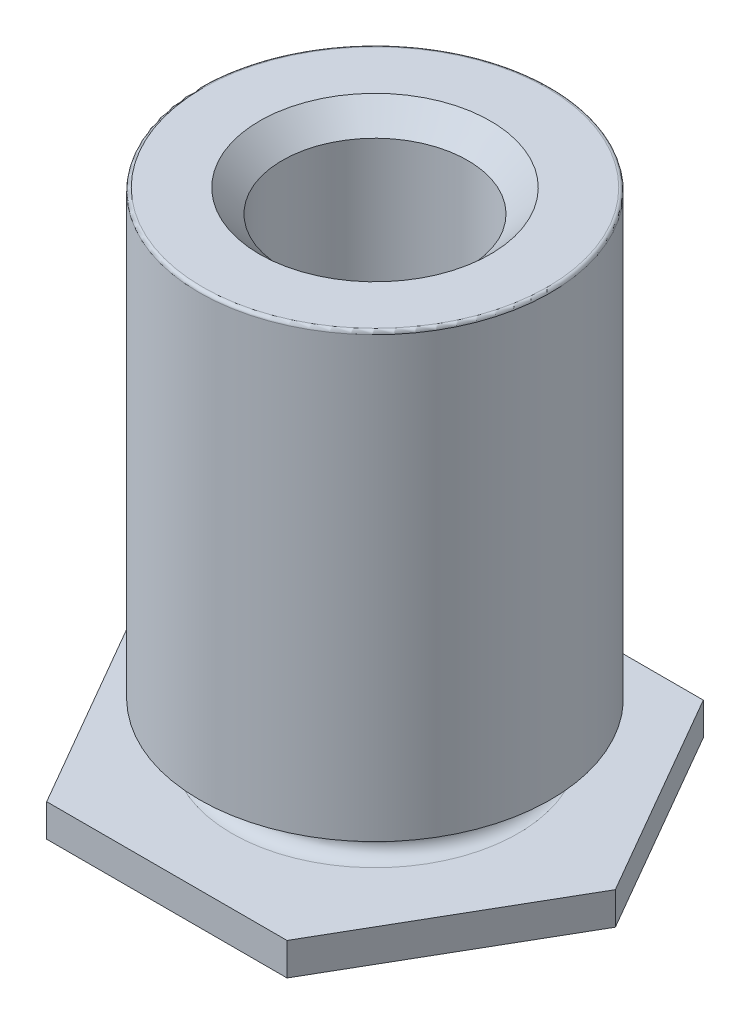
ISO-10303-21;
HEADER;
FILE_DESCRIPTION(('STEP AP214'),'2;1');
FILE_NAME('part.step','',(''),(''),'','','');
FILE_SCHEMA(('AUTOMOTIVE_DESIGN { 1 0 10303 214 1 1 1 1 }'));
ENDSEC;
DATA;
#1=APPLICATION_CONTEXT('core data for automotive mechanical design processes');
#2=APPLICATION_PROTOCOL_DEFINITION('international standard','automotive_design',2000,#1);
#3=PRODUCT_CONTEXT('',#1,'mechanical');
#4=PRODUCT('Part','Part','',(#3));
#5=PRODUCT_RELATED_PRODUCT_CATEGORY('part','',(#4));
#6=PRODUCT_DEFINITION_FORMATION('','',#4);
#7=PRODUCT_DEFINITION_CONTEXT('part definition',#1,'design');
#8=PRODUCT_DEFINITION('design','',#6,#7);
#9=PRODUCT_DEFINITION_SHAPE('','',#8);
#10=(LENGTH_UNIT() NAMED_UNIT(*) SI_UNIT(.MILLI.,.METRE.));
#11=(NAMED_UNIT(*) PLANE_ANGLE_UNIT() SI_UNIT($,.RADIAN.));
#12=(NAMED_UNIT(*) SI_UNIT($,.STERADIAN.) SOLID_ANGLE_UNIT());
#13=UNCERTAINTY_MEASURE_WITH_UNIT(LENGTH_MEASURE(1.E-05),#10,'distance_accuracy_value','');
#14=(GEOMETRIC_REPRESENTATION_CONTEXT(3) GLOBAL_UNCERTAINTY_ASSIGNED_CONTEXT((#13)) GLOBAL_UNIT_ASSIGNED_CONTEXT((#10,
#11,#12)) REPRESENTATION_CONTEXT('',''));
#15=CARTESIAN_POINT('',(0.,0.,0.));
#16=DIRECTION('',(0.,0.,1.));
#17=DIRECTION('',(1.,0.,0.));
#18=AXIS2_PLACEMENT_3D('',#15,#16,#17);
#19=CARTESIAN_POINT('',(-3.69504172281361,11.2480230740355,0.));
#20=DIRECTION('',(-0.866025403784439,0.,-0.5));
#21=DIRECTION('',(-0.5,0.,0.866025403784439));
#22=AXIS2_PLACEMENT_3D('',#19,#20,#21);
#23=PLANE('',#22);
#24=DIRECTION('',(0.5,0.,-0.866025403784439));
#25=VECTOR('',#24,1.);
#26=CARTESIAN_POINT('',(-3.69504172281361,0.,0.));
#27=LINE('',#26,#25);
#28=CARTESIAN_POINT('',(-3.69504172281361,0.,0.));
#29=VERTEX_POINT('',#28);
#30=CARTESIAN_POINT('',(-1.8475208614068,0.,-3.2));
#31=VERTEX_POINT('',#30);
#32=EDGE_CURVE('E101',#29,#31,#27,.T.);
#33=ORIENTED_EDGE('',*,*,#32,.F.);
#34=DIRECTION('',(0.,1.,0.));
#35=VECTOR('',#34,1.);
#36=CARTESIAN_POINT('',(-3.69504172281361,11.2480230740355,0.));
#37=LINE('',#36,#35);
#38=CARTESIAN_POINT('',(-3.69504172281361,0.499999999999998,0.));
#39=VERTEX_POINT('',#38);
#40=EDGE_CURVE('E93',#39,#29,#37,.F.);
#41=ORIENTED_EDGE('',*,*,#40,.F.);
#42=DIRECTION('',(-0.5,0.,0.866025403784439));
#43=VECTOR('',#42,1.);
#44=CARTESIAN_POINT('',(-1.8475208614068,0.5,-3.2));
#45=LINE('',#44,#43);
#46=CARTESIAN_POINT('',(-1.8475208614068,0.499999999999999,-3.2));
#47=VERTEX_POINT('',#46);
#48=EDGE_CURVE('E219',#47,#39,#45,.T.);
#49=ORIENTED_EDGE('',*,*,#48,.F.);
#50=DIRECTION('',(0.,1.,0.));
#51=VECTOR('',#50,1.);
#52=CARTESIAN_POINT('',(-1.8475208614068,11.2480230740355,-3.2));
#53=LINE('',#52,#51);
#54=EDGE_CURVE('E109',#31,#47,#53,.T.);
#55=ORIENTED_EDGE('',*,*,#54,.F.);
#56=EDGE_LOOP('',(#33,#41,#49,#55));
#57=FACE_BOUND('',#56,.T.);
#58=ADVANCED_FACE('F17',(#57),#23,.T.);
#59=CARTESIAN_POINT('',(-1.8475208614068,11.2480230740355,3.2));
#60=DIRECTION('',(-0.866025403784439,0.,0.5));
#61=DIRECTION('',(0.5,0.,0.866025403784439));
#62=AXIS2_PLACEMENT_3D('',#59,#60,#61);
#63=PLANE('',#62);
#64=DIRECTION('',(-0.5,0.,-0.866025403784439));
#65=VECTOR('',#64,1.);
#66=CARTESIAN_POINT('',(-1.8475208614068,0.,3.2));
#67=LINE('',#66,#65);
#68=CARTESIAN_POINT('',(-1.8475208614068,0.,3.2));
#69=VERTEX_POINT('',#68);
#70=EDGE_CURVE('E96',#69,#29,#67,.T.);
#71=ORIENTED_EDGE('',*,*,#70,.F.);
#72=DIRECTION('',(0.,1.,0.));
#73=VECTOR('',#72,1.);
#74=CARTESIAN_POINT('',(-1.8475208614068,11.2480230740355,3.2));
#75=LINE('',#74,#73);
#76=CARTESIAN_POINT('',(-1.8475208614068,0.499999999999998,3.2));
#77=VERTEX_POINT('',#76);
#78=EDGE_CURVE('E84',#77,#69,#75,.F.);
#79=ORIENTED_EDGE('',*,*,#78,.F.);
#80=DIRECTION('',(0.5,0.,0.866025403784438));
#81=VECTOR('',#80,1.);
#82=CARTESIAN_POINT('',(-3.69504172281361,0.5,0.));
#83=LINE('',#82,#81);
#84=EDGE_CURVE('E246',#39,#77,#83,.T.);
#85=ORIENTED_EDGE('',*,*,#84,.F.);
#86=ORIENTED_EDGE('',*,*,#40,.T.);
#87=EDGE_LOOP('',(#71,#79,#85,#86));
#88=FACE_BOUND('',#87,.T.);
#89=ADVANCED_FACE('F97',(#88),#63,.T.);
#90=CARTESIAN_POINT('',(1.8475208614068,11.2480230740355,3.2));
#91=DIRECTION('',(0.,0.,1.));
#92=DIRECTION('',(1.,0.,0.));
#93=AXIS2_PLACEMENT_3D('',#90,#91,#92);
#94=PLANE('',#93);
#95=DIRECTION('',(1.,0.,0.));
#96=VECTOR('',#95,1.);
#97=CARTESIAN_POINT('',(0.,0.,3.2));
#98=LINE('',#97,#96);
#99=CARTESIAN_POINT('',(1.8475208614068,0.,3.2));
#100=VERTEX_POINT('',#99);
#101=EDGE_CURVE('E81',#100,#69,#98,.F.);
#102=ORIENTED_EDGE('',*,*,#101,.F.);
#103=DIRECTION('',(0.,1.,0.));
#104=VECTOR('',#103,1.);
#105=CARTESIAN_POINT('',(1.8475208614068,11.2480230740355,3.2));
#106=LINE('',#105,#104);
#107=CARTESIAN_POINT('',(1.8475208614068,0.5,3.2));
#108=VERTEX_POINT('',#107);
#109=EDGE_CURVE('E92',#108,#100,#106,.F.);
#110=ORIENTED_EDGE('',*,*,#109,.F.);
#111=DIRECTION('',(1.,0.,0.));
#112=VECTOR('',#111,1.);
#113=CARTESIAN_POINT('',(-2.2,0.5,3.2));
#114=LINE('',#113,#112);
#115=EDGE_CURVE('E88',#77,#108,#114,.T.);
#116=ORIENTED_EDGE('',*,*,#115,.F.);
#117=ORIENTED_EDGE('',*,*,#78,.T.);
#118=EDGE_LOOP('',(#102,#110,#116,#117));
#119=FACE_BOUND('',#118,.T.);
#120=ADVANCED_FACE('F86',(#119),#94,.T.);
#121=CARTESIAN_POINT('',(3.69504172281361,11.2480230740355,0.));
#122=DIRECTION('',(0.866025403784439,0.,0.5));
#123=DIRECTION('',(0.5,0.,-0.866025403784439));
#124=AXIS2_PLACEMENT_3D('',#121,#122,#123);
#125=PLANE('',#124);
#126=DIRECTION('',(-0.5,0.,0.866025403784439));
#127=VECTOR('',#126,1.);
#128=CARTESIAN_POINT('',(3.69504172281361,0.,0.));
#129=LINE('',#128,#127);
#130=CARTESIAN_POINT('',(3.69504172281361,0.,0.));
#131=VERTEX_POINT('',#130);
#132=EDGE_CURVE('E108',#131,#100,#129,.T.);
#133=ORIENTED_EDGE('',*,*,#132,.F.);
#134=DIRECTION('',(0.,1.,0.));
#135=VECTOR('',#134,1.);
#136=CARTESIAN_POINT('',(3.69504172281361,11.2480230740355,0.));
#137=LINE('',#136,#135);
#138=CARTESIAN_POINT('',(3.69504172281361,0.5,0.));
#139=VERTEX_POINT('',#138);
#140=EDGE_CURVE('E117',#139,#131,#137,.F.);
#141=ORIENTED_EDGE('',*,*,#140,.F.);
#142=DIRECTION('',(0.5,0.,-0.866025403784439));
#143=VECTOR('',#142,1.);
#144=CARTESIAN_POINT('',(1.8475208614068,0.5,3.2));
#145=LINE('',#144,#143);
#146=EDGE_CURVE('E241',#108,#139,#145,.T.);
#147=ORIENTED_EDGE('',*,*,#146,.F.);
#148=ORIENTED_EDGE('',*,*,#109,.T.);
#149=EDGE_LOOP('',(#133,#141,#147,#148));
#150=FACE_BOUND('',#149,.T.);
#151=ADVANCED_FACE('F240',(#150),#125,.T.);
#152=CARTESIAN_POINT('',(1.8475208614068,11.2480230740355,-3.2));
#153=DIRECTION('',(0.866025403784439,0.,-0.5));
#154=DIRECTION('',(-0.5,0.,-0.866025403784439));
#155=AXIS2_PLACEMENT_3D('',#152,#153,#154);
#156=PLANE('',#155);
#157=DIRECTION('',(0.5,0.,0.866025403784439));
#158=VECTOR('',#157,1.);
#159=CARTESIAN_POINT('',(1.8475208614068,0.,-3.2));
#160=LINE('',#159,#158);
#161=CARTESIAN_POINT('',(1.8475208614068,0.,-3.2));
#162=VERTEX_POINT('',#161);
#163=EDGE_CURVE('E220',#162,#131,#160,.T.);
#164=ORIENTED_EDGE('',*,*,#163,.F.);
#165=DIRECTION('',(0.,1.,0.));
#166=VECTOR('',#165,1.);
#167=CARTESIAN_POINT('',(1.8475208614068,11.2480230740355,-3.2));
#168=LINE('',#167,#166);
#169=CARTESIAN_POINT('',(1.8475208614068,0.5,-3.2));
#170=VERTEX_POINT('',#169);
#171=EDGE_CURVE('E112',#170,#162,#168,.F.);
#172=ORIENTED_EDGE('',*,*,#171,.F.);
#173=DIRECTION('',(-0.5,0.,-0.866025403784439));
#174=VECTOR('',#173,1.);
#175=CARTESIAN_POINT('',(3.69504172281361,0.5,0.));
#176=LINE('',#175,#174);
#177=EDGE_CURVE('E236',#139,#170,#176,.T.);
#178=ORIENTED_EDGE('',*,*,#177,.F.);
#179=ORIENTED_EDGE('',*,*,#140,.T.);
#180=EDGE_LOOP('',(#164,#172,#178,#179));
#181=FACE_BOUND('',#180,.T.);
#182=ADVANCED_FACE('F235',(#181),#156,.T.);
#183=CARTESIAN_POINT('',(-1.8475208614068,11.2480230740355,-3.2));
#184=DIRECTION('',(0.,0.,-1.));
#185=DIRECTION('',(-1.,0.,0.));
#186=AXIS2_PLACEMENT_3D('',#183,#184,#185);
#187=PLANE('',#186);
#188=DIRECTION('',(1.,0.,0.));
#189=VECTOR('',#188,1.);
#190=CARTESIAN_POINT('',(0.,0.,-3.2));
#191=LINE('',#190,#189);
#192=EDGE_CURVE('E222',#31,#162,#191,.T.);
#193=ORIENTED_EDGE('',*,*,#192,.F.);
#194=ORIENTED_EDGE('',*,*,#54,.T.);
#195=DIRECTION('',(1.,0.,0.));
#196=VECTOR('',#195,1.);
#197=CARTESIAN_POINT('',(-2.2,0.5,-3.2));
#198=LINE('',#197,#196);
#199=EDGE_CURVE('E129',#170,#47,#198,.F.);
#200=ORIENTED_EDGE('',*,*,#199,.F.);
#201=ORIENTED_EDGE('',*,*,#171,.T.);
#202=EDGE_LOOP('',(#193,#194,#200,#201));
#203=FACE_BOUND('',#202,.T.);
#204=ADVANCED_FACE('F230',(#203),#187,.T.);
#205=CARTESIAN_POINT('',(0.,0.,0.));
#206=DIRECTION('',(0.,-1.,0.));
#207=DIRECTION('',(0.,0.,-1.));
#208=AXIS2_PLACEMENT_3D('',#205,#206,#207);
#209=PLANE('',#208);
#210=ORIENTED_EDGE('',*,*,#163,.T.);
#211=ORIENTED_EDGE('',*,*,#132,.T.);
#212=ORIENTED_EDGE('',*,*,#101,.T.);
#213=ORIENTED_EDGE('',*,*,#70,.T.);
#214=ORIENTED_EDGE('',*,*,#32,.T.);
#215=ORIENTED_EDGE('',*,*,#192,.T.);
#216=EDGE_LOOP('',(#210,#211,#212,#213,#214,#215));
#217=FACE_BOUND('',#216,.T.);
#218=CARTESIAN_POINT('',(0.,0.,0.));
#219=DIRECTION('',(0.,1.,0.));
#220=DIRECTION('',(0.,0.,1.));
#221=AXIS2_PLACEMENT_3D('',#218,#219,#220);
#222=CIRCLE('',#221,1.425);
#223=CARTESIAN_POINT('',(0.,0.,1.425));
#224=VERTEX_POINT('',#223);
#225=EDGE_CURVE('E125',#224,#224,#222,.T.);
#226=ORIENTED_EDGE('',*,*,#225,.T.);
#227=EDGE_LOOP('',(#226));
#228=FACE_BOUND('',#227,.T.);
#229=ADVANCED_FACE('F105',(#217,#228),#209,.T.);
#230=CARTESIAN_POINT('',(-2.2,0.5,0.));
#231=DIRECTION('',(0.,1.,0.));
#232=DIRECTION('',(0.,0.,1.));
#233=AXIS2_PLACEMENT_3D('',#230,#231,#232);
#234=PLANE('',#233);
#235=ORIENTED_EDGE('',*,*,#177,.T.);
#236=ORIENTED_EDGE('',*,*,#199,.T.);
#237=ORIENTED_EDGE('',*,*,#48,.T.);
#238=ORIENTED_EDGE('',*,*,#84,.T.);
#239=ORIENTED_EDGE('',*,*,#115,.T.);
#240=ORIENTED_EDGE('',*,*,#146,.T.);
#241=EDGE_LOOP('',(#235,#236,#237,#238,#239,#240));
#242=FACE_BOUND('',#241,.T.);
#243=CARTESIAN_POINT('',(0.,0.499999999999999,0.));
#244=DIRECTION('',(0.,1.,0.));
#245=DIRECTION('',(0.,0.,1.));
#246=AXIS2_PLACEMENT_3D('',#243,#244,#245);
#247=CIRCLE('',#246,2.2);
#248=CARTESIAN_POINT('',(0.,0.499999999999999,-2.2));
#249=VERTEX_POINT('',#248);
#250=CARTESIAN_POINT('',(0.,0.499999999999999,2.2));
#251=VERTEX_POINT('',#250);
#252=EDGE_CURVE('E273',#249,#251,#247,.F.);
#253=ORIENTED_EDGE('',*,*,#252,.T.);
#254=CARTESIAN_POINT('',(0.,0.499999999999999,0.));
#255=DIRECTION('',(0.,1.,0.));
#256=DIRECTION('',(0.,0.,-1.));
#257=AXIS2_PLACEMENT_3D('',#254,#255,#256);
#258=CIRCLE('',#257,2.2);
#259=EDGE_CURVE('E128',#251,#249,#258,.F.);
#260=ORIENTED_EDGE('',*,*,#259,.T.);
#261=EDGE_LOOP('',(#253,#260));
#262=FACE_BOUND('',#261,.T.);
#263=ADVANCED_FACE('F244',(#242,#262),#234,.T.);
#264=CARTESIAN_POINT('',(0.,-2.,0.));
#265=DIRECTION('',(0.,1.,0.));
#266=DIRECTION('',(0.,0.,1.));
#267=AXIS2_PLACEMENT_3D('',#264,#265,#266);
#268=CYLINDRICAL_SURFACE('',#267,1.425);
#269=ORIENTED_EDGE('',*,*,#225,.F.);
#270=EDGE_LOOP('',(#269));
#271=FACE_BOUND('',#270,.T.);
#272=CARTESIAN_POINT('',(0.,7.65000000001237,0.));
#273=DIRECTION('',(0.,1.,0.));
#274=DIRECTION('',(0.,0.,1.));
#275=AXIS2_PLACEMENT_3D('',#272,#273,#274);
#276=CIRCLE('',#275,1.42499999992651);
#277=CARTESIAN_POINT('',(0.,7.65000000001237,1.42499999992651));
#278=VERTEX_POINT('',#277);
#279=EDGE_CURVE('E193',#278,#278,#276,.T.);
#280=ORIENTED_EDGE('',*,*,#279,.T.);
#281=EDGE_LOOP('',(#280));
#282=FACE_BOUND('',#281,.T.);
#283=ADVANCED_FACE('F202',(#271,#282),#268,.F.);
#284=CARTESIAN_POINT('',(0.,0.699999999999999,0.));
#285=DIRECTION('',(0.,1.,0.));
#286=DIRECTION('',(0.,0.,1.));
#287=AXIS2_PLACEMENT_3D('',#284,#285,#286);
#288=TOROIDAL_SURFACE('',#287,2.2,0.2);
#289=CARTESIAN_POINT('',(0.,0.699999999999999,0.));
#290=DIRECTION('',(0.,1.,0.));
#291=DIRECTION('',(0.,0.,1.));
#292=AXIS2_PLACEMENT_3D('',#289,#290,#291);
#293=CIRCLE('',#292,2.);
#294=CARTESIAN_POINT('',(0.,0.699999999999999,2.));
#295=VERTEX_POINT('',#294);
#296=EDGE_CURVE('E124',#295,#295,#293,.T.);
#297=ORIENTED_EDGE('',*,*,#296,.F.);
#298=EDGE_LOOP('',(#297));
#299=FACE_BOUND('',#298,.T.);
#300=ORIENTED_EDGE('',*,*,#259,.F.);
#301=ORIENTED_EDGE('',*,*,#252,.F.);
#302=EDGE_LOOP('',(#300,#301));
#303=FACE_BOUND('',#302,.T.);
#304=ADVANCED_FACE('F197',(#299,#303),#288,.F.);
#305=CARTESIAN_POINT('',(0.,8.0000000000382,0.));
#306=DIRECTION('',(0.,1.,0.));
#307=DIRECTION('',(0.,0.,1.));
#308=AXIS2_PLACEMENT_3D('',#305,#306,#307);
#309=CONICAL_SURFACE('',#308,1.77499999995234,0.785398163397448);
#310=ORIENTED_EDGE('',*,*,#279,.F.);
#311=EDGE_LOOP('',(#310));
#312=FACE_BOUND('',#311,.T.);
#313=CARTESIAN_POINT('',(0.,8.0000000000382,0.));
#314=DIRECTION('',(0.,1.,0.));
#315=DIRECTION('',(0.,0.,1.));
#316=AXIS2_PLACEMENT_3D('',#313,#314,#315);
#317=CIRCLE('',#316,1.77499999995234);
#318=CARTESIAN_POINT('',(0.,8.0000000000382,1.77499999995234));
#319=VERTEX_POINT('',#318);
#320=EDGE_CURVE('E121',#319,#319,#317,.F.);
#321=ORIENTED_EDGE('',*,*,#320,.F.);
#322=EDGE_LOOP('',(#321));
#323=FACE_BOUND('',#322,.T.);
#324=ADVANCED_FACE('F201',(#312,#323),#309,.F.);
#325=CARTESIAN_POINT('',(0.,10.3973176060485,0.));
#326=DIRECTION('',(0.,1.,0.));
#327=DIRECTION('',(0.,0.,1.));
#328=AXIS2_PLACEMENT_3D('',#325,#326,#327);
#329=CYLINDRICAL_SURFACE('',#328,2.);
#330=CARTESIAN_POINT('',(0.,0.795854811599384,0.));
#331=DIRECTION('',(0.,1.,0.));
#332=DIRECTION('',(0.,0.,1.));
#333=AXIS2_PLACEMENT_3D('',#330,#331,#332);
#334=CIRCLE('',#333,2.00000000006639);
#335=CARTESIAN_POINT('',(0.,0.795854811599384,2.00000000006639));
#336=VERTEX_POINT('',#335);
#337=EDGE_CURVE('E155',#336,#336,#334,.T.);
#338=ORIENTED_EDGE('',*,*,#337,.F.);
#339=EDGE_LOOP('',(#338));
#340=FACE_BOUND('',#339,.T.);
#341=ORIENTED_EDGE('',*,*,#296,.T.);
#342=EDGE_LOOP('',(#341));
#343=FACE_BOUND('',#342,.T.);
#344=ADVANCED_FACE('F172',(#340,#343),#329,.T.);
#345=CARTESIAN_POINT('',(-2.65,8.,0.));
#346=DIRECTION('',(0.,1.,0.));
#347=DIRECTION('',(0.,0.,1.));
#348=AXIS2_PLACEMENT_3D('',#345,#346,#347);
#349=PLANE('',#348);
#350=CARTESIAN_POINT('',(0.,8.,0.));
#351=DIRECTION('',(0.,-1.,0.));
#352=DIRECTION('',(0.,0.,-1.));
#353=AXIS2_PLACEMENT_3D('',#350,#351,#352);
#354=CIRCLE('',#353,2.65);
#355=CARTESIAN_POINT('',(0.,8.,-2.65));
#356=VERTEX_POINT('',#355);
#357=CARTESIAN_POINT('',(0.,8.,2.65));
#358=VERTEX_POINT('',#357);
#359=EDGE_CURVE('E158',#356,#358,#354,.T.);
#360=ORIENTED_EDGE('',*,*,#359,.F.);
#361=CARTESIAN_POINT('',(0.,8.,0.));
#362=DIRECTION('',(0.,-1.,0.));
#363=DIRECTION('',(0.,0.,1.));
#364=AXIS2_PLACEMENT_3D('',#361,#362,#363);
#365=CIRCLE('',#364,2.65);
#366=EDGE_CURVE('E36',#358,#356,#365,.T.);
#367=ORIENTED_EDGE('',*,*,#366,.F.);
#368=EDGE_LOOP('',(#360,#367));
#369=FACE_BOUND('',#368,.T.);
#370=ORIENTED_EDGE('',*,*,#320,.T.);
#371=EDGE_LOOP('',(#370));
#372=FACE_BOUND('',#371,.T.);
#373=ADVANCED_FACE('F163',(#369,#372),#349,.T.);
#374=CARTESIAN_POINT('',(0.,1.19999999998299,0.));
#375=DIRECTION('',(0.,1.,0.));
#376=DIRECTION('',(0.,0.,1.));
#377=AXIS2_PLACEMENT_3D('',#374,#375,#376);
#378=CONICAL_SURFACE('',#377,2.69999999994752,1.0471975511757);
#379=CARTESIAN_POINT('',(0.,1.2,0.));
#380=DIRECTION('',(0.,1.,0.));
#381=DIRECTION('',(0.,0.,1.));
#382=AXIS2_PLACEMENT_3D('',#379,#380,#381);
#383=CIRCLE('',#382,2.7);
#384=CARTESIAN_POINT('',(0.,1.2,2.7));
#385=VERTEX_POINT('',#384);
#386=EDGE_CURVE('E28',#385,#385,#383,.T.);
#387=ORIENTED_EDGE('',*,*,#386,.F.);
#388=EDGE_LOOP('',(#387));
#389=FACE_BOUND('',#388,.T.);
#390=ORIENTED_EDGE('',*,*,#337,.T.);
#391=EDGE_LOOP('',(#390));
#392=FACE_BOUND('',#391,.T.);
#393=ADVANCED_FACE('F148',(#389,#392),#378,.T.);
#394=CARTESIAN_POINT('',(0.,7.95,0.));
#395=DIRECTION('',(0.,1.,0.));
#396=DIRECTION('',(0.,0.,1.));
#397=AXIS2_PLACEMENT_3D('',#394,#395,#396);
#398=TOROIDAL_SURFACE('',#397,2.65,0.0499999999999997);
#399=ORIENTED_EDGE('',*,*,#366,.T.);
#400=ORIENTED_EDGE('',*,*,#359,.T.);
#401=EDGE_LOOP('',(#399,#400));
#402=FACE_BOUND('',#401,.T.);
#403=CARTESIAN_POINT('',(0.,7.95,0.));
#404=DIRECTION('',(0.,1.,0.));
#405=DIRECTION('',(0.,0.,1.));
#406=AXIS2_PLACEMENT_3D('',#403,#404,#405);
#407=CIRCLE('',#406,2.7);
#408=CARTESIAN_POINT('',(0.,7.95,2.7));
#409=VERTEX_POINT('',#408);
#410=EDGE_CURVE('E11',#409,#409,#407,.F.);
#411=ORIENTED_EDGE('',*,*,#410,.F.);
#412=EDGE_LOOP('',(#411));
#413=FACE_BOUND('',#412,.T.);
#414=ADVANCED_FACE('F136',(#402,#413),#398,.T.);
#415=CARTESIAN_POINT('',(0.,10.3973176060485,0.));
#416=DIRECTION('',(0.,1.,0.));
#417=DIRECTION('',(0.,0.,1.));
#418=AXIS2_PLACEMENT_3D('',#415,#416,#417);
#419=CYLINDRICAL_SURFACE('',#418,2.7);
#420=ORIENTED_EDGE('',*,*,#410,.T.);
#421=EDGE_LOOP('',(#420));
#422=FACE_BOUND('',#421,.T.);
#423=ORIENTED_EDGE('',*,*,#386,.T.);
#424=EDGE_LOOP('',(#423));
#425=FACE_BOUND('',#424,.T.);
#426=ADVANCED_FACE('F147',(#422,#425),#419,.T.);
#427=CLOSED_SHELL('',(#58,#89,#120,#151,#182,#204,#229,#263,#283,#304,#324,#344,#373,#393,#414,#426));
#428=MANIFOLD_SOLID_BREP('B1',#427);
#429=ADVANCED_BREP_SHAPE_REPRESENTATION('',(#18,#428),#14);
#430=SHAPE_DEFINITION_REPRESENTATION(#9,#429);
ENDSEC;
END-ISO-10303-21;
